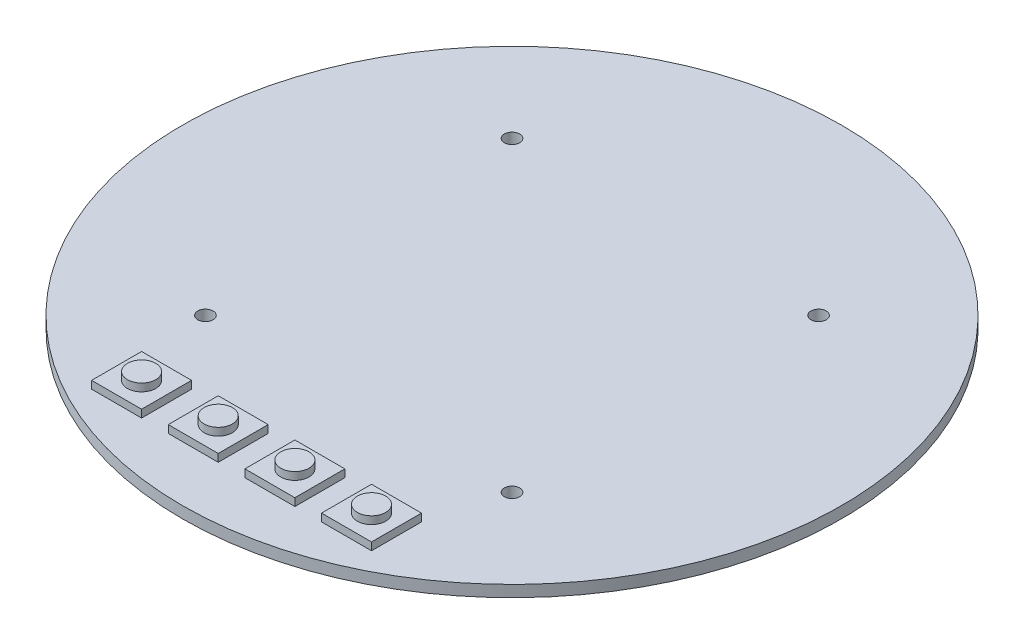
ISO-10303-21;
HEADER;
FILE_DESCRIPTION(('STEP AP214'),'2;1');
FILE_NAME('part.step','',(''),(''),'','','');
FILE_SCHEMA(('AUTOMOTIVE_DESIGN { 1 0 10303 214 1 1 1 1 }'));
ENDSEC;
DATA;
#1=APPLICATION_CONTEXT('core data for automotive mechanical design processes');
#2=APPLICATION_PROTOCOL_DEFINITION('international standard','automotive_design',2000,#1);
#3=PRODUCT_CONTEXT('',#1,'mechanical');
#4=PRODUCT('Part','Part','',(#3));
#5=PRODUCT_RELATED_PRODUCT_CATEGORY('part','',(#4));
#6=PRODUCT_DEFINITION_FORMATION('','',#4);
#7=PRODUCT_DEFINITION_CONTEXT('part definition',#1,'design');
#8=PRODUCT_DEFINITION('design','',#6,#7);
#9=PRODUCT_DEFINITION_SHAPE('','',#8);
#10=(LENGTH_UNIT() NAMED_UNIT(*) SI_UNIT(.MILLI.,.METRE.));
#11=(NAMED_UNIT(*) PLANE_ANGLE_UNIT() SI_UNIT($,.RADIAN.));
#12=(NAMED_UNIT(*) SI_UNIT($,.STERADIAN.) SOLID_ANGLE_UNIT());
#13=UNCERTAINTY_MEASURE_WITH_UNIT(LENGTH_MEASURE(1.E-05),#10,'distance_accuracy_value','');
#14=(GEOMETRIC_REPRESENTATION_CONTEXT(3) GLOBAL_UNCERTAINTY_ASSIGNED_CONTEXT((#13)) GLOBAL_UNIT_ASSIGNED_CONTEXT((#10,
#11,#12)) REPRESENTATION_CONTEXT('',''));
#15=CARTESIAN_POINT('',(0.,0.,0.));
#16=DIRECTION('',(0.,0.,1.));
#17=DIRECTION('',(1.,0.,0.));
#18=AXIS2_PLACEMENT_3D('',#15,#16,#17);
#19=CARTESIAN_POINT('',(0.,0.75,0.));
#20=DIRECTION('',(0.,1.,0.));
#21=DIRECTION('',(0.,0.,1.));
#22=AXIS2_PLACEMENT_3D('',#19,#20,#21);
#23=PLANE('',#22);
#24=CARTESIAN_POINT('',(20.,0.75,20.));
#25=DIRECTION('',(0.,1.,0.));
#26=DIRECTION('',(0.,0.,1.));
#27=AXIS2_PLACEMENT_3D('',#24,#25,#26);
#28=CIRCLE('',#27,1.);
#29=CARTESIAN_POINT('',(20.,0.75,21.));
#30=VERTEX_POINT('',#29);
#31=EDGE_CURVE('E297',#30,#30,#28,.T.);
#32=ORIENTED_EDGE('',*,*,#31,.F.);
#33=EDGE_LOOP('',(#32));
#34=FACE_BOUND('',#33,.T.);
#35=CARTESIAN_POINT('',(-20.,0.75,-20.));
#36=DIRECTION('',(0.,1.,0.));
#37=DIRECTION('',(0.,0.,1.));
#38=AXIS2_PLACEMENT_3D('',#35,#36,#37);
#39=CIRCLE('',#38,1.);
#40=CARTESIAN_POINT('',(-20.,0.75,-19.));
#41=VERTEX_POINT('',#40);
#42=EDGE_CURVE('E309',#41,#41,#39,.T.);
#43=ORIENTED_EDGE('',*,*,#42,.F.);
#44=EDGE_LOOP('',(#43));
#45=FACE_BOUND('',#44,.T.);
#46=CARTESIAN_POINT('',(0.,0.75,0.));
#47=DIRECTION('',(0.,1.,0.));
#48=DIRECTION('',(0.,0.,1.));
#49=AXIS2_PLACEMENT_3D('',#46,#47,#48);
#50=CIRCLE('',#49,43.);
#51=CARTESIAN_POINT('',(0.,0.75,43.));
#52=VERTEX_POINT('',#51);
#53=EDGE_CURVE('E11',#52,#52,#50,.T.);
#54=ORIENTED_EDGE('',*,*,#53,.T.);
#55=EDGE_LOOP('',(#54));
#56=FACE_BOUND('',#55,.T.);
#57=CARTESIAN_POINT('',(-20.,0.75,20.));
#58=DIRECTION('',(0.,1.,0.));
#59=DIRECTION('',(0.,0.,-1.));
#60=AXIS2_PLACEMENT_3D('',#57,#58,#59);
#61=CIRCLE('',#60,1.);
#62=CARTESIAN_POINT('',(-20.,0.75,19.));
#63=VERTEX_POINT('',#62);
#64=EDGE_CURVE('E303',#63,#63,#61,.T.);
#65=ORIENTED_EDGE('',*,*,#64,.F.);
#66=EDGE_LOOP('',(#65));
#67=FACE_BOUND('',#66,.T.);
#68=CARTESIAN_POINT('',(20.,0.75,-20.));
#69=DIRECTION('',(0.,1.,0.));
#70=DIRECTION('',(0.,0.,-1.));
#71=AXIS2_PLACEMENT_3D('',#68,#69,#70);
#72=CIRCLE('',#71,1.);
#73=CARTESIAN_POINT('',(20.,0.75,-21.));
#74=VERTEX_POINT('',#73);
#75=EDGE_CURVE('E291',#74,#74,#72,.T.);
#76=ORIENTED_EDGE('',*,*,#75,.F.);
#77=EDGE_LOOP('',(#76));
#78=FACE_BOUND('',#77,.T.);
#79=DIRECTION('',(0.,0.,-1.));
#80=VECTOR('',#79,1.);
#81=CARTESIAN_POINT('',(-12.5620358235037,0.75,0.));
#82=LINE('',#81,#80);
#83=CARTESIAN_POINT('',(-12.5620358235037,0.75,35.7682394058541));
#84=VERTEX_POINT('',#83);
#85=CARTESIAN_POINT('',(-12.5620358235037,0.75,29.2474879860201));
#86=VERTEX_POINT('',#85);
#87=EDGE_CURVE('E273',#84,#86,#82,.T.);
#88=ORIENTED_EDGE('',*,*,#87,.F.);
#89=DIRECTION('',(1.,0.,0.));
#90=VECTOR('',#89,1.);
#91=CARTESIAN_POINT('',(0.,0.75,35.7682394058541));
#92=LINE('',#91,#90);
#93=CARTESIAN_POINT('',(-19.0827872433377,0.75,35.7682394058541));
#94=VERTEX_POINT('',#93);
#95=EDGE_CURVE('E254',#94,#84,#92,.T.);
#96=ORIENTED_EDGE('',*,*,#95,.F.);
#97=DIRECTION('',(0.,0.,-1.));
#98=VECTOR('',#97,1.);
#99=CARTESIAN_POINT('',(-19.0827872433377,0.75,0.));
#100=LINE('',#99,#98);
#101=CARTESIAN_POINT('',(-19.0827872433377,0.75,29.2474879860201));
#102=VERTEX_POINT('',#101);
#103=EDGE_CURVE('E259',#94,#102,#100,.T.);
#104=ORIENTED_EDGE('',*,*,#103,.T.);
#105=DIRECTION('',(1.,0.,0.));
#106=VECTOR('',#105,1.);
#107=CARTESIAN_POINT('',(0.,0.75,29.2474879860201));
#108=LINE('',#107,#106);
#109=EDGE_CURVE('E276',#102,#86,#108,.T.);
#110=ORIENTED_EDGE('',*,*,#109,.T.);
#111=EDGE_LOOP('',(#88,#96,#104,#110));
#112=FACE_BOUND('',#111,.T.);
#113=DIRECTION('',(0.,0.,-1.));
#114=VECTOR('',#113,1.);
#115=CARTESIAN_POINT('',(-2.56203582350367,0.75,0.));
#116=LINE('',#115,#114);
#117=CARTESIAN_POINT('',(-2.56203582350367,0.75,35.7682394058541));
#118=VERTEX_POINT('',#117);
#119=CARTESIAN_POINT('',(-2.56203582350367,0.75,29.2474879860201));
#120=VERTEX_POINT('',#119);
#121=EDGE_CURVE('E234',#118,#120,#116,.T.);
#122=ORIENTED_EDGE('',*,*,#121,.F.);
#123=DIRECTION('',(1.,0.,0.));
#124=VECTOR('',#123,1.);
#125=CARTESIAN_POINT('',(10.,0.75,35.7682394058541));
#126=LINE('',#125,#124);
#127=CARTESIAN_POINT('',(-9.08278724333767,0.75,35.7682394058541));
#128=VERTEX_POINT('',#127);
#129=EDGE_CURVE('E215',#128,#118,#126,.T.);
#130=ORIENTED_EDGE('',*,*,#129,.F.);
#131=DIRECTION('',(0.,0.,-1.));
#132=VECTOR('',#131,1.);
#133=CARTESIAN_POINT('',(-9.08278724333767,0.75,0.));
#134=LINE('',#133,#132);
#135=CARTESIAN_POINT('',(-9.08278724333767,0.75,29.2474879860201));
#136=VERTEX_POINT('',#135);
#137=EDGE_CURVE('E220',#128,#136,#134,.T.);
#138=ORIENTED_EDGE('',*,*,#137,.T.);
#139=DIRECTION('',(1.,0.,0.));
#140=VECTOR('',#139,1.);
#141=CARTESIAN_POINT('',(10.,0.75,29.2474879860201));
#142=LINE('',#141,#140);
#143=EDGE_CURVE('E237',#136,#120,#142,.T.);
#144=ORIENTED_EDGE('',*,*,#143,.T.);
#145=EDGE_LOOP('',(#122,#130,#138,#144));
#146=FACE_BOUND('',#145,.T.);
#147=DIRECTION('',(0.,0.,-1.));
#148=VECTOR('',#147,1.);
#149=CARTESIAN_POINT('',(7.43796417649633,0.75,0.));
#150=LINE('',#149,#148);
#151=CARTESIAN_POINT('',(7.43796417649633,0.75,35.7682394058541));
#152=VERTEX_POINT('',#151);
#153=CARTESIAN_POINT('',(7.43796417649633,0.75,29.2474879860201));
#154=VERTEX_POINT('',#153);
#155=EDGE_CURVE('E177',#152,#154,#150,.T.);
#156=ORIENTED_EDGE('',*,*,#155,.F.);
#157=DIRECTION('',(1.,0.,0.));
#158=VECTOR('',#157,1.);
#159=CARTESIAN_POINT('',(20.,0.75,35.7682394058541));
#160=LINE('',#159,#158);
#161=CARTESIAN_POINT('',(0.917212756662327,0.75,35.7682394058541));
#162=VERTEX_POINT('',#161);
#163=EDGE_CURVE('E174',#162,#152,#160,.T.);
#164=ORIENTED_EDGE('',*,*,#163,.F.);
#165=DIRECTION('',(0.,0.,-1.));
#166=VECTOR('',#165,1.);
#167=CARTESIAN_POINT('',(0.917212756662327,0.75,0.));
#168=LINE('',#167,#166);
#169=CARTESIAN_POINT('',(0.917212756662327,0.75,29.2474879860201));
#170=VERTEX_POINT('',#169);
#171=EDGE_CURVE('E187',#162,#170,#168,.T.);
#172=ORIENTED_EDGE('',*,*,#171,.T.);
#173=DIRECTION('',(1.,0.,0.));
#174=VECTOR('',#173,1.);
#175=CARTESIAN_POINT('',(20.,0.75,29.2474879860201));
#176=LINE('',#175,#174);
#177=EDGE_CURVE('E201',#170,#154,#176,.T.);
#178=ORIENTED_EDGE('',*,*,#177,.T.);
#179=EDGE_LOOP('',(#156,#164,#172,#178));
#180=FACE_BOUND('',#179,.T.);
#181=DIRECTION('',(0.,0.,-1.));
#182=VECTOR('',#181,1.);
#183=CARTESIAN_POINT('',(17.4379641764963,0.75,0.));
#184=LINE('',#183,#182);
#185=CARTESIAN_POINT('',(17.4379641764963,0.75,35.7682394058541));
#186=VERTEX_POINT('',#185);
#187=CARTESIAN_POINT('',(17.4379641764963,0.75,29.2474879860201));
#188=VERTEX_POINT('',#187);
#189=EDGE_CURVE('E54',#186,#188,#184,.T.);
#190=ORIENTED_EDGE('',*,*,#189,.F.);
#191=DIRECTION('',(1.,0.,0.));
#192=VECTOR('',#191,1.);
#193=CARTESIAN_POINT('',(30.,0.75,35.7682394058541));
#194=LINE('',#193,#192);
#195=CARTESIAN_POINT('',(10.9172127566623,0.75,35.7682394058541));
#196=VERTEX_POINT('',#195);
#197=EDGE_CURVE('E173',#196,#186,#194,.T.);
#198=ORIENTED_EDGE('',*,*,#197,.F.);
#199=DIRECTION('',(0.,0.,-1.));
#200=VECTOR('',#199,1.);
#201=CARTESIAN_POINT('',(10.9172127566623,0.75,0.));
#202=LINE('',#201,#200);
#203=CARTESIAN_POINT('',(10.9172127566623,0.75,29.2474879860201));
#204=VERTEX_POINT('',#203);
#205=EDGE_CURVE('E640',#196,#204,#202,.T.);
#206=ORIENTED_EDGE('',*,*,#205,.T.);
#207=DIRECTION('',(1.,0.,0.));
#208=VECTOR('',#207,1.);
#209=CARTESIAN_POINT('',(30.,0.75,29.2474879860201));
#210=LINE('',#209,#208);
#211=EDGE_CURVE('E59',#204,#188,#210,.T.);
#212=ORIENTED_EDGE('',*,*,#211,.T.);
#213=EDGE_LOOP('',(#190,#198,#206,#212));
#214=FACE_BOUND('',#213,.T.);
#215=ADVANCED_FACE('F39',(#34,#45,#56,#67,#78,#112,#146,#180,#214),#23,.T.);
#216=CARTESIAN_POINT('',(0.,-0.75,0.));
#217=DIRECTION('',(0.,1.,0.));
#218=DIRECTION('',(0.,0.,1.));
#219=AXIS2_PLACEMENT_3D('',#216,#217,#218);
#220=PLANE('',#219);
#221=CARTESIAN_POINT('',(0.,-0.75,0.));
#222=DIRECTION('',(0.,1.,0.));
#223=DIRECTION('',(0.,0.,1.));
#224=AXIS2_PLACEMENT_3D('',#221,#222,#223);
#225=CIRCLE('',#224,43.);
#226=CARTESIAN_POINT('',(0.,-0.75,43.));
#227=VERTEX_POINT('',#226);
#228=EDGE_CURVE('E43',#227,#227,#225,.T.);
#229=ORIENTED_EDGE('',*,*,#228,.F.);
#230=EDGE_LOOP('',(#229));
#231=FACE_BOUND('',#230,.T.);
#232=CARTESIAN_POINT('',(-20.,-0.75,-20.));
#233=DIRECTION('',(0.,1.,0.));
#234=DIRECTION('',(0.,0.,1.));
#235=AXIS2_PLACEMENT_3D('',#232,#233,#234);
#236=CIRCLE('',#235,1.);
#237=CARTESIAN_POINT('',(-20.,-0.75,-19.));
#238=VERTEX_POINT('',#237);
#239=EDGE_CURVE('E306',#238,#238,#236,.T.);
#240=ORIENTED_EDGE('',*,*,#239,.T.);
#241=EDGE_LOOP('',(#240));
#242=FACE_BOUND('',#241,.T.);
#243=CARTESIAN_POINT('',(-20.,-0.75,20.));
#244=DIRECTION('',(0.,1.,0.));
#245=DIRECTION('',(0.,0.,-1.));
#246=AXIS2_PLACEMENT_3D('',#243,#244,#245);
#247=CIRCLE('',#246,1.);
#248=CARTESIAN_POINT('',(-20.,-0.75,19.));
#249=VERTEX_POINT('',#248);
#250=EDGE_CURVE('E300',#249,#249,#247,.T.);
#251=ORIENTED_EDGE('',*,*,#250,.T.);
#252=EDGE_LOOP('',(#251));
#253=FACE_BOUND('',#252,.T.);
#254=CARTESIAN_POINT('',(20.,-0.75,20.));
#255=DIRECTION('',(0.,1.,0.));
#256=DIRECTION('',(0.,0.,1.));
#257=AXIS2_PLACEMENT_3D('',#254,#255,#256);
#258=CIRCLE('',#257,1.);
#259=CARTESIAN_POINT('',(20.,-0.75,21.));
#260=VERTEX_POINT('',#259);
#261=EDGE_CURVE('E294',#260,#260,#258,.T.);
#262=ORIENTED_EDGE('',*,*,#261,.T.);
#263=EDGE_LOOP('',(#262));
#264=FACE_BOUND('',#263,.T.);
#265=CARTESIAN_POINT('',(20.,-0.75,-20.));
#266=DIRECTION('',(0.,1.,0.));
#267=DIRECTION('',(0.,0.,-1.));
#268=AXIS2_PLACEMENT_3D('',#265,#266,#267);
#269=CIRCLE('',#268,1.);
#270=CARTESIAN_POINT('',(20.,-0.75,-21.));
#271=VERTEX_POINT('',#270);
#272=EDGE_CURVE('E290',#271,#271,#269,.T.);
#273=ORIENTED_EDGE('',*,*,#272,.T.);
#274=EDGE_LOOP('',(#273));
#275=FACE_BOUND('',#274,.T.);
#276=ADVANCED_FACE('F315',(#231,#242,#253,#264,#275),#220,.F.);
#277=CARTESIAN_POINT('',(0.,0.75,0.));
#278=DIRECTION('',(0.,-1.,0.));
#279=DIRECTION('',(0.,0.,-1.));
#280=AXIS2_PLACEMENT_3D('',#277,#278,#279);
#281=CYLINDRICAL_SURFACE('',#280,43.);
#282=ORIENTED_EDGE('',*,*,#53,.F.);
#283=EDGE_LOOP('',(#282));
#284=FACE_BOUND('',#283,.T.);
#285=ORIENTED_EDGE('',*,*,#228,.T.);
#286=EDGE_LOOP('',(#285));
#287=FACE_BOUND('',#286,.T.);
#288=ADVANCED_FACE('F41',(#284,#287),#281,.T.);
#289=CARTESIAN_POINT('',(-20.,0.75,-20.));
#290=DIRECTION('',(0.,-1.,0.));
#291=DIRECTION('',(0.,0.,-1.));
#292=AXIS2_PLACEMENT_3D('',#289,#290,#291);
#293=CYLINDRICAL_SURFACE('',#292,1.);
#294=ORIENTED_EDGE('',*,*,#42,.T.);
#295=EDGE_LOOP('',(#294));
#296=FACE_BOUND('',#295,.T.);
#297=ORIENTED_EDGE('',*,*,#239,.F.);
#298=EDGE_LOOP('',(#297));
#299=FACE_BOUND('',#298,.T.);
#300=ADVANCED_FACE('F318',(#296,#299),#293,.F.);
#301=CARTESIAN_POINT('',(-20.,0.75,20.));
#302=DIRECTION('',(0.,-1.,0.));
#303=DIRECTION('',(0.,0.,-1.));
#304=AXIS2_PLACEMENT_3D('',#301,#302,#303);
#305=CYLINDRICAL_SURFACE('',#304,1.);
#306=ORIENTED_EDGE('',*,*,#64,.T.);
#307=EDGE_LOOP('',(#306));
#308=FACE_BOUND('',#307,.T.);
#309=ORIENTED_EDGE('',*,*,#250,.F.);
#310=EDGE_LOOP('',(#309));
#311=FACE_BOUND('',#310,.T.);
#312=ADVANCED_FACE('F320',(#308,#311),#305,.F.);
#313=CARTESIAN_POINT('',(20.,0.75,20.));
#314=DIRECTION('',(0.,-1.,0.));
#315=DIRECTION('',(0.,0.,-1.));
#316=AXIS2_PLACEMENT_3D('',#313,#314,#315);
#317=CYLINDRICAL_SURFACE('',#316,1.);
#318=ORIENTED_EDGE('',*,*,#31,.T.);
#319=EDGE_LOOP('',(#318));
#320=FACE_BOUND('',#319,.T.);
#321=ORIENTED_EDGE('',*,*,#261,.F.);
#322=EDGE_LOOP('',(#321));
#323=FACE_BOUND('',#322,.T.);
#324=ADVANCED_FACE('F327',(#320,#323),#317,.F.);
#325=CARTESIAN_POINT('',(20.,0.75,-20.));
#326=DIRECTION('',(0.,-1.,0.));
#327=DIRECTION('',(0.,0.,-1.));
#328=AXIS2_PLACEMENT_3D('',#325,#326,#327);
#329=CYLINDRICAL_SURFACE('',#328,1.);
#330=ORIENTED_EDGE('',*,*,#75,.T.);
#331=EDGE_LOOP('',(#330));
#332=FACE_BOUND('',#331,.T.);
#333=ORIENTED_EDGE('',*,*,#272,.F.);
#334=EDGE_LOOP('',(#333));
#335=FACE_BOUND('',#334,.T.);
#336=ADVANCED_FACE('F432',(#332,#335),#329,.F.);
#337=CARTESIAN_POINT('',(0.,1.75,35.7682394058541));
#338=DIRECTION('',(0.,0.,-1.));
#339=DIRECTION('',(-1.,0.,0.));
#340=AXIS2_PLACEMENT_3D('',#337,#338,#339);
#341=PLANE('',#340);
#342=ORIENTED_EDGE('',*,*,#95,.T.);
#343=DIRECTION('',(0.,-1.,0.));
#344=VECTOR('',#343,1.);
#345=CARTESIAN_POINT('',(-12.5620358235037,1.75,35.7682394058541));
#346=LINE('',#345,#344);
#347=CARTESIAN_POINT('',(-12.5620358235037,1.75,35.7682394058541));
#348=VERTEX_POINT('',#347);
#349=EDGE_CURVE('E287',#348,#84,#346,.T.);
#350=ORIENTED_EDGE('',*,*,#349,.F.);
#351=DIRECTION('',(1.,0.,0.));
#352=VECTOR('',#351,1.);
#353=CARTESIAN_POINT('',(0.,1.75,35.7682394058541));
#354=LINE('',#353,#352);
#355=CARTESIAN_POINT('',(-19.0827872433377,1.75,35.7682394058541));
#356=VERTEX_POINT('',#355);
#357=EDGE_CURVE('E258',#356,#348,#354,.T.);
#358=ORIENTED_EDGE('',*,*,#357,.F.);
#359=DIRECTION('',(0.,-1.,0.));
#360=VECTOR('',#359,1.);
#361=CARTESIAN_POINT('',(-19.0827872433377,1.75,35.7682394058541));
#362=LINE('',#361,#360);
#363=EDGE_CURVE('E270',#356,#94,#362,.T.);
#364=ORIENTED_EDGE('',*,*,#363,.T.);
#365=EDGE_LOOP('',(#342,#350,#358,#364));
#366=FACE_BOUND('',#365,.T.);
#367=ADVANCED_FACE('F428',(#366),#341,.F.);
#368=CARTESIAN_POINT('',(-12.5620358235037,1.75,0.));
#369=DIRECTION('',(-1.,0.,0.));
#370=DIRECTION('',(0.,0.,1.));
#371=AXIS2_PLACEMENT_3D('',#368,#369,#370);
#372=PLANE('',#371);
#373=ORIENTED_EDGE('',*,*,#87,.T.);
#374=DIRECTION('',(0.,-1.,0.));
#375=VECTOR('',#374,1.);
#376=CARTESIAN_POINT('',(-12.5620358235037,1.75,29.2474879860201));
#377=LINE('',#376,#375);
#378=CARTESIAN_POINT('',(-12.5620358235037,1.75,29.2474879860201));
#379=VERTEX_POINT('',#378);
#380=EDGE_CURVE('E284',#379,#86,#377,.T.);
#381=ORIENTED_EDGE('',*,*,#380,.F.);
#382=DIRECTION('',(0.,0.,-1.));
#383=VECTOR('',#382,1.);
#384=CARTESIAN_POINT('',(-12.5620358235037,1.75,0.));
#385=LINE('',#384,#383);
#386=EDGE_CURVE('E262',#348,#379,#385,.T.);
#387=ORIENTED_EDGE('',*,*,#386,.F.);
#388=ORIENTED_EDGE('',*,*,#349,.T.);
#389=EDGE_LOOP('',(#373,#381,#387,#388));
#390=FACE_BOUND('',#389,.T.);
#391=ADVANCED_FACE('F424',(#390),#372,.F.);
#392=CARTESIAN_POINT('',(0.,1.75,29.2474879860201));
#393=DIRECTION('',(0.,0.,-1.));
#394=DIRECTION('',(-1.,0.,0.));
#395=AXIS2_PLACEMENT_3D('',#392,#393,#394);
#396=PLANE('',#395);
#397=ORIENTED_EDGE('',*,*,#109,.F.);
#398=DIRECTION('',(0.,-1.,0.));
#399=VECTOR('',#398,1.);
#400=CARTESIAN_POINT('',(-19.0827872433377,1.75,29.2474879860201));
#401=LINE('',#400,#399);
#402=CARTESIAN_POINT('',(-19.0827872433377,1.75,29.2474879860201));
#403=VERTEX_POINT('',#402);
#404=EDGE_CURVE('E281',#403,#102,#401,.T.);
#405=ORIENTED_EDGE('',*,*,#404,.F.);
#406=DIRECTION('',(1.,0.,0.));
#407=VECTOR('',#406,1.);
#408=CARTESIAN_POINT('',(0.,1.75,29.2474879860201));
#409=LINE('',#408,#407);
#410=EDGE_CURVE('E264',#403,#379,#409,.T.);
#411=ORIENTED_EDGE('',*,*,#410,.T.);
#412=ORIENTED_EDGE('',*,*,#380,.T.);
#413=EDGE_LOOP('',(#397,#405,#411,#412));
#414=FACE_BOUND('',#413,.T.);
#415=ADVANCED_FACE('F420',(#414),#396,.T.);
#416=CARTESIAN_POINT('',(-19.0827872433377,1.75,0.));
#417=DIRECTION('',(-1.,0.,0.));
#418=DIRECTION('',(0.,0.,1.));
#419=AXIS2_PLACEMENT_3D('',#416,#417,#418);
#420=PLANE('',#419);
#421=ORIENTED_EDGE('',*,*,#103,.F.);
#422=ORIENTED_EDGE('',*,*,#363,.F.);
#423=DIRECTION('',(0.,0.,-1.));
#424=VECTOR('',#423,1.);
#425=CARTESIAN_POINT('',(-19.0827872433377,1.75,0.));
#426=LINE('',#425,#424);
#427=EDGE_CURVE('E267',#356,#403,#426,.T.);
#428=ORIENTED_EDGE('',*,*,#427,.T.);
#429=ORIENTED_EDGE('',*,*,#404,.T.);
#430=EDGE_LOOP('',(#421,#422,#428,#429));
#431=FACE_BOUND('',#430,.T.);
#432=ADVANCED_FACE('F416',(#431),#420,.T.);
#433=CARTESIAN_POINT('',(0.,1.75,0.));
#434=DIRECTION('',(0.,1.,0.));
#435=DIRECTION('',(0.,0.,1.));
#436=AXIS2_PLACEMENT_3D('',#433,#434,#435);
#437=PLANE('',#436);
#438=CARTESIAN_POINT('',(-15.8224115334207,1.75,32.5078636959371));
#439=DIRECTION('',(0.,1.,0.));
#440=DIRECTION('',(0.,0.,1.));
#441=AXIS2_PLACEMENT_3D('',#438,#439,#440);
#442=CIRCLE('',#441,1.84833933516794);
#443=CARTESIAN_POINT('',(-15.8224115334207,1.75,34.356203031105));
#444=VERTEX_POINT('',#443);
#445=EDGE_CURVE('E255',#444,#444,#442,.T.);
#446=ORIENTED_EDGE('',*,*,#445,.F.);
#447=EDGE_LOOP('',(#446));
#448=FACE_BOUND('',#447,.T.);
#449=ORIENTED_EDGE('',*,*,#357,.T.);
#450=ORIENTED_EDGE('',*,*,#386,.T.);
#451=ORIENTED_EDGE('',*,*,#410,.F.);
#452=ORIENTED_EDGE('',*,*,#427,.F.);
#453=EDGE_LOOP('',(#449,#450,#451,#452));
#454=FACE_BOUND('',#453,.T.);
#455=ADVANCED_FACE('F412',(#448,#454),#437,.T.);
#456=CARTESIAN_POINT('',(-15.8224115334207,2.75,32.5078636959371));
#457=DIRECTION('',(0.,-1.,0.));
#458=DIRECTION('',(0.,0.,-1.));
#459=AXIS2_PLACEMENT_3D('',#456,#457,#458);
#460=CYLINDRICAL_SURFACE('',#459,1.84833933516794);
#461=ORIENTED_EDGE('',*,*,#445,.T.);
#462=EDGE_LOOP('',(#461));
#463=FACE_BOUND('',#462,.T.);
#464=CARTESIAN_POINT('',(-15.8224115334207,2.75,32.5078636959371));
#465=DIRECTION('',(0.,1.,0.));
#466=DIRECTION('',(0.,0.,1.));
#467=AXIS2_PLACEMENT_3D('',#464,#465,#466);
#468=CIRCLE('',#467,1.84833933516794);
#469=CARTESIAN_POINT('',(-15.8224115334207,2.75,34.356203031105));
#470=VERTEX_POINT('',#469);
#471=EDGE_CURVE('E251',#470,#470,#468,.T.);
#472=ORIENTED_EDGE('',*,*,#471,.F.);
#473=EDGE_LOOP('',(#472));
#474=FACE_BOUND('',#473,.T.);
#475=ADVANCED_FACE('F408',(#463,#474),#460,.T.);
#476=CARTESIAN_POINT('',(0.,2.75,0.));
#477=DIRECTION('',(0.,1.,0.));
#478=DIRECTION('',(0.,0.,1.));
#479=AXIS2_PLACEMENT_3D('',#476,#477,#478);
#480=PLANE('',#479);
#481=ORIENTED_EDGE('',*,*,#471,.T.);
#482=EDGE_LOOP('',(#481));
#483=FACE_BOUND('',#482,.T.);
#484=ADVANCED_FACE('F404',(#483),#480,.T.);
#485=CARTESIAN_POINT('',(10.,1.75,35.7682394058541));
#486=DIRECTION('',(0.,0.,-1.));
#487=DIRECTION('',(-1.,0.,0.));
#488=AXIS2_PLACEMENT_3D('',#485,#486,#487);
#489=PLANE('',#488);
#490=ORIENTED_EDGE('',*,*,#129,.T.);
#491=DIRECTION('',(0.,-1.,0.));
#492=VECTOR('',#491,1.);
#493=CARTESIAN_POINT('',(-2.56203582350367,1.75,35.7682394058541));
#494=LINE('',#493,#492);
#495=CARTESIAN_POINT('',(-2.56203582350367,1.75,35.7682394058541));
#496=VERTEX_POINT('',#495);
#497=EDGE_CURVE('E248',#496,#118,#494,.T.);
#498=ORIENTED_EDGE('',*,*,#497,.F.);
#499=DIRECTION('',(1.,0.,0.));
#500=VECTOR('',#499,1.);
#501=CARTESIAN_POINT('',(10.,1.75,35.7682394058541));
#502=LINE('',#501,#500);
#503=CARTESIAN_POINT('',(-9.08278724333767,1.75,35.7682394058541));
#504=VERTEX_POINT('',#503);
#505=EDGE_CURVE('E219',#504,#496,#502,.T.);
#506=ORIENTED_EDGE('',*,*,#505,.F.);
#507=DIRECTION('',(0.,-1.,0.));
#508=VECTOR('',#507,1.);
#509=CARTESIAN_POINT('',(-9.08278724333767,1.75,35.7682394058541));
#510=LINE('',#509,#508);
#511=EDGE_CURVE('E231',#504,#128,#510,.T.);
#512=ORIENTED_EDGE('',*,*,#511,.T.);
#513=EDGE_LOOP('',(#490,#498,#506,#512));
#514=FACE_BOUND('',#513,.T.);
#515=ADVANCED_FACE('F400',(#514),#489,.F.);
#516=CARTESIAN_POINT('',(-2.56203582350367,1.75,0.));
#517=DIRECTION('',(-1.,0.,0.));
#518=DIRECTION('',(0.,0.,1.));
#519=AXIS2_PLACEMENT_3D('',#516,#517,#518);
#520=PLANE('',#519);
#521=ORIENTED_EDGE('',*,*,#121,.T.);
#522=DIRECTION('',(0.,-1.,0.));
#523=VECTOR('',#522,1.);
#524=CARTESIAN_POINT('',(-2.56203582350367,1.75,29.2474879860201));
#525=LINE('',#524,#523);
#526=CARTESIAN_POINT('',(-2.56203582350367,1.75,29.2474879860201));
#527=VERTEX_POINT('',#526);
#528=EDGE_CURVE('E245',#527,#120,#525,.T.);
#529=ORIENTED_EDGE('',*,*,#528,.F.);
#530=DIRECTION('',(0.,0.,-1.));
#531=VECTOR('',#530,1.);
#532=CARTESIAN_POINT('',(-2.56203582350367,1.75,0.));
#533=LINE('',#532,#531);
#534=EDGE_CURVE('E223',#496,#527,#533,.T.);
#535=ORIENTED_EDGE('',*,*,#534,.F.);
#536=ORIENTED_EDGE('',*,*,#497,.T.);
#537=EDGE_LOOP('',(#521,#529,#535,#536));
#538=FACE_BOUND('',#537,.T.);
#539=ADVANCED_FACE('F396',(#538),#520,.F.);
#540=CARTESIAN_POINT('',(10.,1.75,29.2474879860201));
#541=DIRECTION('',(0.,0.,-1.));
#542=DIRECTION('',(-1.,0.,0.));
#543=AXIS2_PLACEMENT_3D('',#540,#541,#542);
#544=PLANE('',#543);
#545=ORIENTED_EDGE('',*,*,#143,.F.);
#546=DIRECTION('',(0.,-1.,0.));
#547=VECTOR('',#546,1.);
#548=CARTESIAN_POINT('',(-9.08278724333767,1.75,29.2474879860201));
#549=LINE('',#548,#547);
#550=CARTESIAN_POINT('',(-9.08278724333767,1.75,29.2474879860201));
#551=VERTEX_POINT('',#550);
#552=EDGE_CURVE('E242',#551,#136,#549,.T.);
#553=ORIENTED_EDGE('',*,*,#552,.F.);
#554=DIRECTION('',(1.,0.,0.));
#555=VECTOR('',#554,1.);
#556=CARTESIAN_POINT('',(10.,1.75,29.2474879860201));
#557=LINE('',#556,#555);
#558=EDGE_CURVE('E225',#551,#527,#557,.T.);
#559=ORIENTED_EDGE('',*,*,#558,.T.);
#560=ORIENTED_EDGE('',*,*,#528,.T.);
#561=EDGE_LOOP('',(#545,#553,#559,#560));
#562=FACE_BOUND('',#561,.T.);
#563=ADVANCED_FACE('F392',(#562),#544,.T.);
#564=CARTESIAN_POINT('',(-9.08278724333767,1.75,0.));
#565=DIRECTION('',(-1.,0.,0.));
#566=DIRECTION('',(0.,0.,1.));
#567=AXIS2_PLACEMENT_3D('',#564,#565,#566);
#568=PLANE('',#567);
#569=ORIENTED_EDGE('',*,*,#137,.F.);
#570=ORIENTED_EDGE('',*,*,#511,.F.);
#571=DIRECTION('',(0.,0.,-1.));
#572=VECTOR('',#571,1.);
#573=CARTESIAN_POINT('',(-9.08278724333767,1.75,0.));
#574=LINE('',#573,#572);
#575=EDGE_CURVE('E228',#504,#551,#574,.T.);
#576=ORIENTED_EDGE('',*,*,#575,.T.);
#577=ORIENTED_EDGE('',*,*,#552,.T.);
#578=EDGE_LOOP('',(#569,#570,#576,#577));
#579=FACE_BOUND('',#578,.T.);
#580=ADVANCED_FACE('F388',(#579),#568,.T.);
#581=CARTESIAN_POINT('',(10.,1.75,0.));
#582=DIRECTION('',(0.,1.,0.));
#583=DIRECTION('',(0.,0.,1.));
#584=AXIS2_PLACEMENT_3D('',#581,#582,#583);
#585=PLANE('',#584);
#586=CARTESIAN_POINT('',(-5.82241153342067,1.75,32.5078636959371));
#587=DIRECTION('',(0.,1.,0.));
#588=DIRECTION('',(0.,0.,1.));
#589=AXIS2_PLACEMENT_3D('',#586,#587,#588);
#590=CIRCLE('',#589,1.84833933516794);
#591=CARTESIAN_POINT('',(-5.82241153342067,1.75,34.356203031105));
#592=VERTEX_POINT('',#591);
#593=EDGE_CURVE('E216',#592,#592,#590,.T.);
#594=ORIENTED_EDGE('',*,*,#593,.F.);
#595=EDGE_LOOP('',(#594));
#596=FACE_BOUND('',#595,.T.);
#597=ORIENTED_EDGE('',*,*,#505,.T.);
#598=ORIENTED_EDGE('',*,*,#534,.T.);
#599=ORIENTED_EDGE('',*,*,#558,.F.);
#600=ORIENTED_EDGE('',*,*,#575,.F.);
#601=EDGE_LOOP('',(#597,#598,#599,#600));
#602=FACE_BOUND('',#601,.T.);
#603=ADVANCED_FACE('F385',(#596,#602),#585,.T.);
#604=CARTESIAN_POINT('',(20.,1.75,35.7682394058541));
#605=DIRECTION('',(0.,0.,-1.));
#606=DIRECTION('',(-1.,0.,0.));
#607=AXIS2_PLACEMENT_3D('',#604,#605,#606);
#608=PLANE('',#607);
#609=ORIENTED_EDGE('',*,*,#163,.T.);
#610=DIRECTION('',(0.,-1.,0.));
#611=VECTOR('',#610,1.);
#612=CARTESIAN_POINT('',(7.43796417649633,1.75,35.7682394058541));
#613=LINE('',#612,#611);
#614=CARTESIAN_POINT('',(7.43796417649633,1.75,35.7682394058541));
#615=VERTEX_POINT('',#614);
#616=EDGE_CURVE('E212',#615,#152,#613,.T.);
#617=ORIENTED_EDGE('',*,*,#616,.F.);
#618=DIRECTION('',(1.,0.,0.));
#619=VECTOR('',#618,1.);
#620=CARTESIAN_POINT('',(20.,1.75,35.7682394058541));
#621=LINE('',#620,#619);
#622=CARTESIAN_POINT('',(0.917212756662327,1.75,35.7682394058541));
#623=VERTEX_POINT('',#622);
#624=EDGE_CURVE('E186',#623,#615,#621,.T.);
#625=ORIENTED_EDGE('',*,*,#624,.F.);
#626=DIRECTION('',(0.,-1.,0.));
#627=VECTOR('',#626,1.);
#628=CARTESIAN_POINT('',(0.917212756662327,1.75,35.7682394058541));
#629=LINE('',#628,#627);
#630=EDGE_CURVE('E197',#623,#162,#629,.T.);
#631=ORIENTED_EDGE('',*,*,#630,.T.);
#632=EDGE_LOOP('',(#609,#617,#625,#631));
#633=FACE_BOUND('',#632,.T.);
#634=ADVANCED_FACE('F357',(#633),#608,.F.);
#635=CARTESIAN_POINT('',(7.43796417649633,1.75,0.));
#636=DIRECTION('',(-1.,0.,0.));
#637=DIRECTION('',(0.,0.,1.));
#638=AXIS2_PLACEMENT_3D('',#635,#636,#637);
#639=PLANE('',#638);
#640=ORIENTED_EDGE('',*,*,#155,.T.);
#641=DIRECTION('',(0.,-1.,0.));
#642=VECTOR('',#641,1.);
#643=CARTESIAN_POINT('',(7.43796417649633,1.75,29.2474879860201));
#644=LINE('',#643,#642);
#645=CARTESIAN_POINT('',(7.43796417649633,1.75,29.2474879860201));
#646=VERTEX_POINT('',#645);
#647=EDGE_CURVE('E209',#646,#154,#644,.T.);
#648=ORIENTED_EDGE('',*,*,#647,.F.);
#649=DIRECTION('',(0.,0.,-1.));
#650=VECTOR('',#649,1.);
#651=CARTESIAN_POINT('',(7.43796417649633,1.75,0.));
#652=LINE('',#651,#650);
#653=EDGE_CURVE('E190',#615,#646,#652,.T.);
#654=ORIENTED_EDGE('',*,*,#653,.F.);
#655=ORIENTED_EDGE('',*,*,#616,.T.);
#656=EDGE_LOOP('',(#640,#648,#654,#655));
#657=FACE_BOUND('',#656,.T.);
#658=ADVANCED_FACE('F354',(#657),#639,.F.);
#659=CARTESIAN_POINT('',(20.,1.75,29.2474879860201));
#660=DIRECTION('',(0.,0.,-1.));
#661=DIRECTION('',(-1.,0.,0.));
#662=AXIS2_PLACEMENT_3D('',#659,#660,#661);
#663=PLANE('',#662);
#664=ORIENTED_EDGE('',*,*,#177,.F.);
#665=DIRECTION('',(0.,-1.,0.));
#666=VECTOR('',#665,1.);
#667=CARTESIAN_POINT('',(0.917212756662327,1.75,29.2474879860201));
#668=LINE('',#667,#666);
#669=CARTESIAN_POINT('',(0.917212756662327,1.75,29.2474879860201));
#670=VERTEX_POINT('',#669);
#671=EDGE_CURVE('E206',#670,#170,#668,.T.);
#672=ORIENTED_EDGE('',*,*,#671,.F.);
#673=DIRECTION('',(1.,0.,0.));
#674=VECTOR('',#673,1.);
#675=CARTESIAN_POINT('',(20.,1.75,29.2474879860201));
#676=LINE('',#675,#674);
#677=EDGE_CURVE('E192',#670,#646,#676,.T.);
#678=ORIENTED_EDGE('',*,*,#677,.T.);
#679=ORIENTED_EDGE('',*,*,#647,.T.);
#680=EDGE_LOOP('',(#664,#672,#678,#679));
#681=FACE_BOUND('',#680,.T.);
#682=ADVANCED_FACE('F364',(#681),#663,.T.);
#683=CARTESIAN_POINT('',(0.917212756662327,1.75,0.));
#684=DIRECTION('',(-1.,0.,0.));
#685=DIRECTION('',(0.,0.,1.));
#686=AXIS2_PLACEMENT_3D('',#683,#684,#685);
#687=PLANE('',#686);
#688=ORIENTED_EDGE('',*,*,#171,.F.);
#689=ORIENTED_EDGE('',*,*,#630,.F.);
#690=DIRECTION('',(0.,0.,-1.));
#691=VECTOR('',#690,1.);
#692=CARTESIAN_POINT('',(0.917212756662327,1.75,0.));
#693=LINE('',#692,#691);
#694=EDGE_CURVE('E195',#623,#670,#693,.T.);
#695=ORIENTED_EDGE('',*,*,#694,.T.);
#696=ORIENTED_EDGE('',*,*,#671,.T.);
#697=EDGE_LOOP('',(#688,#689,#695,#696));
#698=FACE_BOUND('',#697,.T.);
#699=ADVANCED_FACE('F361',(#698),#687,.T.);
#700=CARTESIAN_POINT('',(20.,1.75,0.));
#701=DIRECTION('',(0.,1.,0.));
#702=DIRECTION('',(0.,0.,1.));
#703=AXIS2_PLACEMENT_3D('',#700,#701,#702);
#704=PLANE('',#703);
#705=CARTESIAN_POINT('',(4.17758846657933,1.75,32.5078636959371));
#706=DIRECTION('',(0.,1.,0.));
#707=DIRECTION('',(0.,0.,1.));
#708=AXIS2_PLACEMENT_3D('',#705,#706,#707);
#709=CIRCLE('',#708,1.84833933516794);
#710=CARTESIAN_POINT('',(4.17758846657933,1.75,34.356203031105));
#711=VERTEX_POINT('',#710);
#712=EDGE_CURVE('E183',#711,#711,#709,.T.);
#713=ORIENTED_EDGE('',*,*,#712,.F.);
#714=EDGE_LOOP('',(#713));
#715=FACE_BOUND('',#714,.T.);
#716=ORIENTED_EDGE('',*,*,#624,.T.);
#717=ORIENTED_EDGE('',*,*,#653,.T.);
#718=ORIENTED_EDGE('',*,*,#677,.F.);
#719=ORIENTED_EDGE('',*,*,#694,.F.);
#720=EDGE_LOOP('',(#716,#717,#718,#719));
#721=FACE_BOUND('',#720,.T.);
#722=ADVANCED_FACE('F366',(#715,#721),#704,.T.);
#723=CARTESIAN_POINT('',(30.,1.75,35.7682394058541));
#724=DIRECTION('',(0.,0.,-1.));
#725=DIRECTION('',(-1.,0.,0.));
#726=AXIS2_PLACEMENT_3D('',#723,#724,#725);
#727=PLANE('',#726);
#728=ORIENTED_EDGE('',*,*,#197,.T.);
#729=DIRECTION('',(0.,-1.,0.));
#730=VECTOR('',#729,1.);
#731=CARTESIAN_POINT('',(17.4379641764963,1.75,35.7682394058541));
#732=LINE('',#731,#730);
#733=CARTESIAN_POINT('',(17.4379641764963,1.75,35.7682394058541));
#734=VERTEX_POINT('',#733);
#735=EDGE_CURVE('E154',#734,#186,#732,.T.);
#736=ORIENTED_EDGE('',*,*,#735,.F.);
#737=DIRECTION('',(1.,0.,0.));
#738=VECTOR('',#737,1.);
#739=CARTESIAN_POINT('',(30.,1.75,35.7682394058541));
#740=LINE('',#739,#738);
#741=CARTESIAN_POINT('',(10.9172127566623,1.75,35.7682394058541));
#742=VERTEX_POINT('',#741);
#743=EDGE_CURVE('E161',#742,#734,#740,.T.);
#744=ORIENTED_EDGE('',*,*,#743,.F.);
#745=DIRECTION('',(0.,-1.,0.));
#746=VECTOR('',#745,1.);
#747=CARTESIAN_POINT('',(10.9172127566623,1.75,35.7682394058541));
#748=LINE('',#747,#746);
#749=EDGE_CURVE('E644',#742,#196,#748,.T.);
#750=ORIENTED_EDGE('',*,*,#749,.T.);
#751=EDGE_LOOP('',(#728,#736,#744,#750));
#752=FACE_BOUND('',#751,.T.);
#753=ADVANCED_FACE('F172',(#752),#727,.F.);
#754=CARTESIAN_POINT('',(17.4379641764963,1.75,0.));
#755=DIRECTION('',(-1.,0.,0.));
#756=DIRECTION('',(0.,0.,1.));
#757=AXIS2_PLACEMENT_3D('',#754,#755,#756);
#758=PLANE('',#757);
#759=ORIENTED_EDGE('',*,*,#189,.T.);
#760=DIRECTION('',(0.,-1.,0.));
#761=VECTOR('',#760,1.);
#762=CARTESIAN_POINT('',(17.4379641764963,1.75,29.2474879860201));
#763=LINE('',#762,#761);
#764=CARTESIAN_POINT('',(17.4379641764963,1.75,29.2474879860201));
#765=VERTEX_POINT('',#764);
#766=EDGE_CURVE('E156',#765,#188,#763,.T.);
#767=ORIENTED_EDGE('',*,*,#766,.F.);
#768=DIRECTION('',(0.,0.,-1.));
#769=VECTOR('',#768,1.);
#770=CARTESIAN_POINT('',(17.4379641764963,1.75,0.));
#771=LINE('',#770,#769);
#772=EDGE_CURVE('E150',#734,#765,#771,.T.);
#773=ORIENTED_EDGE('',*,*,#772,.F.);
#774=ORIENTED_EDGE('',*,*,#735,.T.);
#775=EDGE_LOOP('',(#759,#767,#773,#774));
#776=FACE_BOUND('',#775,.T.);
#777=ADVANCED_FACE('F152',(#776),#758,.F.);
#778=CARTESIAN_POINT('',(30.,1.75,29.2474879860201));
#779=DIRECTION('',(0.,0.,-1.));
#780=DIRECTION('',(-1.,0.,0.));
#781=AXIS2_PLACEMENT_3D('',#778,#779,#780);
#782=PLANE('',#781);
#783=ORIENTED_EDGE('',*,*,#211,.F.);
#784=DIRECTION('',(0.,-1.,0.));
#785=VECTOR('',#784,1.);
#786=CARTESIAN_POINT('',(10.9172127566623,1.75,29.2474879860201));
#787=LINE('',#786,#785);
#788=CARTESIAN_POINT('',(10.9172127566623,1.75,29.2474879860201));
#789=VERTEX_POINT('',#788);
#790=EDGE_CURVE('E179',#789,#204,#787,.T.);
#791=ORIENTED_EDGE('',*,*,#790,.F.);
#792=DIRECTION('',(1.,0.,0.));
#793=VECTOR('',#792,1.);
#794=CARTESIAN_POINT('',(30.,1.75,29.2474879860201));
#795=LINE('',#794,#793);
#796=EDGE_CURVE('E160',#789,#765,#795,.T.);
#797=ORIENTED_EDGE('',*,*,#796,.T.);
#798=ORIENTED_EDGE('',*,*,#766,.T.);
#799=EDGE_LOOP('',(#783,#791,#797,#798));
#800=FACE_BOUND('',#799,.T.);
#801=ADVANCED_FACE('F536',(#800),#782,.T.);
#802=CARTESIAN_POINT('',(10.9172127566623,1.75,0.));
#803=DIRECTION('',(-1.,0.,0.));
#804=DIRECTION('',(0.,0.,1.));
#805=AXIS2_PLACEMENT_3D('',#802,#803,#804);
#806=PLANE('',#805);
#807=ORIENTED_EDGE('',*,*,#205,.F.);
#808=ORIENTED_EDGE('',*,*,#749,.F.);
#809=DIRECTION('',(0.,0.,-1.));
#810=VECTOR('',#809,1.);
#811=CARTESIAN_POINT('',(10.9172127566623,1.75,0.));
#812=LINE('',#811,#810);
#813=EDGE_CURVE('E167',#742,#789,#812,.T.);
#814=ORIENTED_EDGE('',*,*,#813,.T.);
#815=ORIENTED_EDGE('',*,*,#790,.T.);
#816=EDGE_LOOP('',(#807,#808,#814,#815));
#817=FACE_BOUND('',#816,.T.);
#818=ADVANCED_FACE('F544',(#817),#806,.T.);
#819=CARTESIAN_POINT('',(30.,1.75,0.));
#820=DIRECTION('',(0.,1.,0.));
#821=DIRECTION('',(0.,0.,1.));
#822=AXIS2_PLACEMENT_3D('',#819,#820,#821);
#823=PLANE('',#822);
#824=CARTESIAN_POINT('',(14.1775884665793,1.75,32.5078636959371));
#825=DIRECTION('',(0.,1.,0.));
#826=DIRECTION('',(0.,0.,1.));
#827=AXIS2_PLACEMENT_3D('',#824,#825,#826);
#828=CIRCLE('',#827,1.84833933516794);
#829=CARTESIAN_POINT('',(14.1775884665793,1.75,34.356203031105));
#830=VERTEX_POINT('',#829);
#831=EDGE_CURVE('E170',#830,#830,#828,.T.);
#832=ORIENTED_EDGE('',*,*,#831,.F.);
#833=EDGE_LOOP('',(#832));
#834=FACE_BOUND('',#833,.T.);
#835=ORIENTED_EDGE('',*,*,#743,.T.);
#836=ORIENTED_EDGE('',*,*,#772,.T.);
#837=ORIENTED_EDGE('',*,*,#796,.F.);
#838=ORIENTED_EDGE('',*,*,#813,.F.);
#839=EDGE_LOOP('',(#835,#836,#837,#838));
#840=FACE_BOUND('',#839,.T.);
#841=ADVANCED_FACE('F165',(#834,#840),#823,.T.);
#842=CARTESIAN_POINT('',(-5.82241153342067,2.75,32.5078636959371));
#843=DIRECTION('',(0.,-1.,0.));
#844=DIRECTION('',(0.,0.,-1.));
#845=AXIS2_PLACEMENT_3D('',#842,#843,#844);
#846=CYLINDRICAL_SURFACE('',#845,1.84833933516794);
#847=ORIENTED_EDGE('',*,*,#593,.T.);
#848=EDGE_LOOP('',(#847));
#849=FACE_BOUND('',#848,.T.);
#850=CARTESIAN_POINT('',(-5.82241153342067,2.75,32.5078636959371));
#851=DIRECTION('',(0.,1.,0.));
#852=DIRECTION('',(0.,0.,1.));
#853=AXIS2_PLACEMENT_3D('',#850,#851,#852);
#854=CIRCLE('',#853,1.84833933516794);
#855=CARTESIAN_POINT('',(-5.82241153342067,2.75,34.356203031105));
#856=VERTEX_POINT('',#855);
#857=EDGE_CURVE('E634',#856,#856,#854,.T.);
#858=ORIENTED_EDGE('',*,*,#857,.F.);
#859=EDGE_LOOP('',(#858));
#860=FACE_BOUND('',#859,.T.);
#861=ADVANCED_FACE('F563',(#849,#860),#846,.T.);
#862=CARTESIAN_POINT('',(10.,2.75,0.));
#863=DIRECTION('',(0.,1.,0.));
#864=DIRECTION('',(0.,0.,1.));
#865=AXIS2_PLACEMENT_3D('',#862,#863,#864);
#866=PLANE('',#865);
#867=ORIENTED_EDGE('',*,*,#857,.T.);
#868=EDGE_LOOP('',(#867));
#869=FACE_BOUND('',#868,.T.);
#870=ADVANCED_FACE('F573',(#869),#866,.T.);
#871=CARTESIAN_POINT('',(4.17758846657933,2.75,32.5078636959371));
#872=DIRECTION('',(0.,-1.,0.));
#873=DIRECTION('',(0.,0.,-1.));
#874=AXIS2_PLACEMENT_3D('',#871,#872,#873);
#875=CYLINDRICAL_SURFACE('',#874,1.84833933516794);
#876=ORIENTED_EDGE('',*,*,#712,.T.);
#877=EDGE_LOOP('',(#876));
#878=FACE_BOUND('',#877,.T.);
#879=CARTESIAN_POINT('',(4.17758846657933,2.75,32.5078636959371));
#880=DIRECTION('',(0.,1.,0.));
#881=DIRECTION('',(0.,0.,1.));
#882=AXIS2_PLACEMENT_3D('',#879,#880,#881);
#883=CIRCLE('',#882,1.84833933516794);
#884=CARTESIAN_POINT('',(4.17758846657933,2.75,34.356203031105));
#885=VERTEX_POINT('',#884);
#886=EDGE_CURVE('E631',#885,#885,#883,.T.);
#887=ORIENTED_EDGE('',*,*,#886,.F.);
#888=EDGE_LOOP('',(#887));
#889=FACE_BOUND('',#888,.T.);
#890=ADVANCED_FACE('F583',(#878,#889),#875,.T.);
#891=CARTESIAN_POINT('',(20.,2.75,0.));
#892=DIRECTION('',(0.,1.,0.));
#893=DIRECTION('',(0.,0.,1.));
#894=AXIS2_PLACEMENT_3D('',#891,#892,#893);
#895=PLANE('',#894);
#896=ORIENTED_EDGE('',*,*,#886,.T.);
#897=EDGE_LOOP('',(#896));
#898=FACE_BOUND('',#897,.T.);
#899=ADVANCED_FACE('F593',(#898),#895,.T.);
#900=CARTESIAN_POINT('',(14.1775884665793,2.75,32.5078636959371));
#901=DIRECTION('',(0.,-1.,0.));
#902=DIRECTION('',(0.,0.,-1.));
#903=AXIS2_PLACEMENT_3D('',#900,#901,#902);
#904=CYLINDRICAL_SURFACE('',#903,1.84833933516794);
#905=ORIENTED_EDGE('',*,*,#831,.T.);
#906=EDGE_LOOP('',(#905));
#907=FACE_BOUND('',#906,.T.);
#908=CARTESIAN_POINT('',(14.1775884665793,2.75,32.5078636959371));
#909=DIRECTION('',(0.,1.,0.));
#910=DIRECTION('',(0.,0.,1.));
#911=AXIS2_PLACEMENT_3D('',#908,#909,#910);
#912=CIRCLE('',#911,1.84833933516794);
#913=CARTESIAN_POINT('',(14.1775884665793,2.75,34.356203031105));
#914=VERTEX_POINT('',#913);
#915=EDGE_CURVE('E629',#914,#914,#912,.T.);
#916=ORIENTED_EDGE('',*,*,#915,.F.);
#917=EDGE_LOOP('',(#916));
#918=FACE_BOUND('',#917,.T.);
#919=ADVANCED_FACE('F603',(#907,#918),#904,.T.);
#920=CARTESIAN_POINT('',(30.,2.75,0.));
#921=DIRECTION('',(0.,1.,0.));
#922=DIRECTION('',(0.,0.,1.));
#923=AXIS2_PLACEMENT_3D('',#920,#921,#922);
#924=PLANE('',#923);
#925=ORIENTED_EDGE('',*,*,#915,.T.);
#926=EDGE_LOOP('',(#925));
#927=FACE_BOUND('',#926,.T.);
#928=ADVANCED_FACE('F613',(#927),#924,.T.);
#929=CLOSED_SHELL('',(#215,#276,#288,#300,#312,#324,#336,#367,#391,#415,#432,#455,#475,#484,
#515,#539,#563,#580,#603,#634,#658,#682,#699,#722,#753,#777,#801,#818,#841,#861,#870,#890,#899,
#919,#928));
#930=MANIFOLD_SOLID_BREP('B2',#929);
#931=ADVANCED_BREP_SHAPE_REPRESENTATION('',(#18,#930),#14);
#932=SHAPE_DEFINITION_REPRESENTATION(#9,#931);
ENDSEC;
END-ISO-10303-21;
